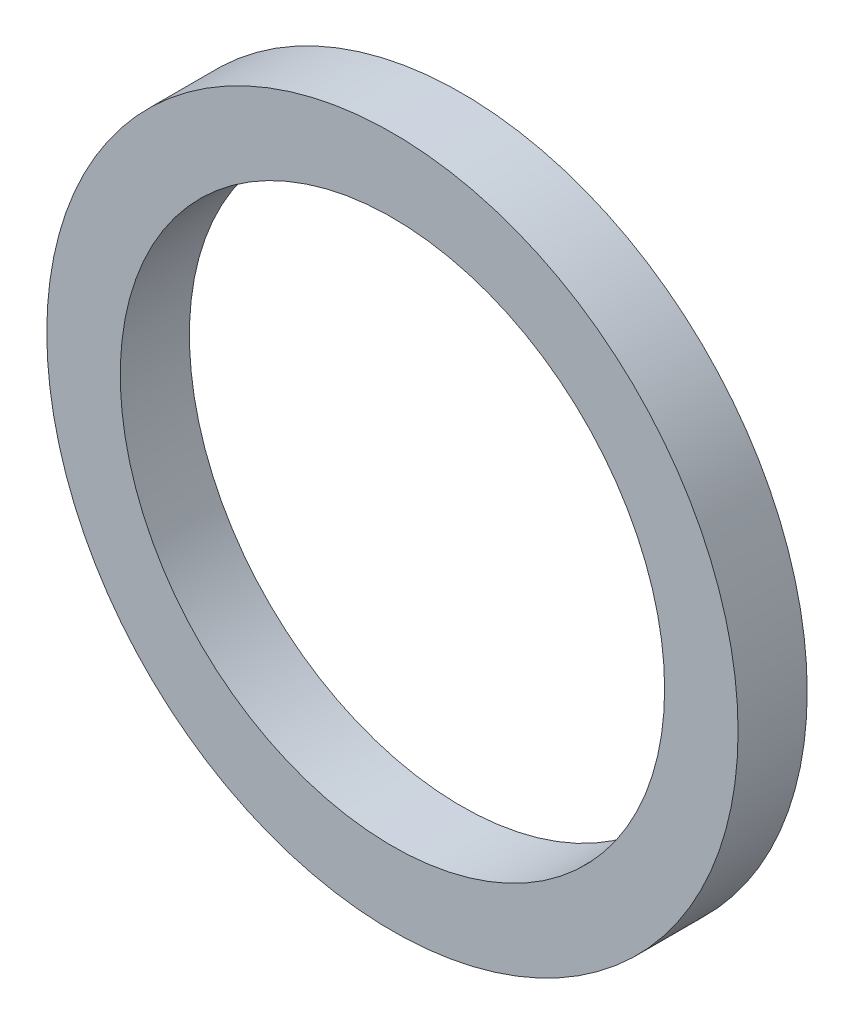
ISO-10303-21;
HEADER;
FILE_DESCRIPTION(('STEP AP214'),'2;1');
FILE_NAME('part.step','',(''),(''),'','','');
FILE_SCHEMA(('AUTOMOTIVE_DESIGN { 1 0 10303 214 1 1 1 1 }'));
ENDSEC;
DATA;
#1=APPLICATION_CONTEXT('core data for automotive mechanical design processes');
#2=APPLICATION_PROTOCOL_DEFINITION('international standard','automotive_design',2000,#1);
#3=PRODUCT_CONTEXT('',#1,'mechanical');
#4=PRODUCT('Part','Part','',(#3));
#5=PRODUCT_RELATED_PRODUCT_CATEGORY('part','',(#4));
#6=PRODUCT_DEFINITION_FORMATION('','',#4);
#7=PRODUCT_DEFINITION_CONTEXT('part definition',#1,'design');
#8=PRODUCT_DEFINITION('design','',#6,#7);
#9=PRODUCT_DEFINITION_SHAPE('','',#8);
#10=(LENGTH_UNIT() NAMED_UNIT(*) SI_UNIT(.MILLI.,.METRE.));
#11=(NAMED_UNIT(*) PLANE_ANGLE_UNIT() SI_UNIT($,.RADIAN.));
#12=(NAMED_UNIT(*) SI_UNIT($,.STERADIAN.) SOLID_ANGLE_UNIT());
#13=UNCERTAINTY_MEASURE_WITH_UNIT(LENGTH_MEASURE(1.E-05),#10,'distance_accuracy_value','');
#14=(GEOMETRIC_REPRESENTATION_CONTEXT(3) GLOBAL_UNCERTAINTY_ASSIGNED_CONTEXT((#13)) GLOBAL_UNIT_ASSIGNED_CONTEXT((#10,
#11,#12)) REPRESENTATION_CONTEXT('',''));
#15=CARTESIAN_POINT('',(0.,0.,0.));
#16=DIRECTION('',(0.,0.,1.));
#17=DIRECTION('',(1.,0.,0.));
#18=AXIS2_PLACEMENT_3D('',#15,#16,#17);
#19=CARTESIAN_POINT('',(0.,0.,0.));
#20=DIRECTION('',(0.,0.,1.));
#21=DIRECTION('',(1.,0.,0.));
#22=AXIS2_PLACEMENT_3D('',#19,#20,#21);
#23=CYLINDRICAL_SURFACE('',#22,15.75);
#24=CARTESIAN_POINT('',(0.,0.,0.));
#25=DIRECTION('',(0.,0.,1.));
#26=DIRECTION('',(1.,0.,0.));
#27=AXIS2_PLACEMENT_3D('',#24,#25,#26);
#28=CIRCLE('',#27,15.75);
#29=CARTESIAN_POINT('',(15.75,0.,0.));
#30=VERTEX_POINT('',#29);
#31=EDGE_CURVE('E25',#30,#30,#28,.T.);
#32=ORIENTED_EDGE('',*,*,#31,.F.);
#33=EDGE_LOOP('',(#32));
#34=FACE_BOUND('',#33,.T.);
#35=CARTESIAN_POINT('',(0.,0.,4.));
#36=DIRECTION('',(0.,0.,-1.));
#37=DIRECTION('',(1.,0.,0.));
#38=AXIS2_PLACEMENT_3D('',#35,#36,#37);
#39=CIRCLE('',#38,15.75);
#40=CARTESIAN_POINT('',(15.75,0.,4.));
#41=VERTEX_POINT('',#40);
#42=EDGE_CURVE('E50',#41,#41,#39,.T.);
#43=ORIENTED_EDGE('',*,*,#42,.F.);
#44=EDGE_LOOP('',(#43));
#45=FACE_BOUND('',#44,.T.);
#46=ADVANCED_FACE('F17',(#34,#45),#23,.F.);
#47=CARTESIAN_POINT('',(0.,0.,0.));
#48=DIRECTION('',(0.,0.,1.));
#49=DIRECTION('',(1.,0.,0.));
#50=AXIS2_PLACEMENT_3D('',#47,#48,#49);
#51=CYLINDRICAL_SURFACE('',#50,20.);
#52=CARTESIAN_POINT('',(0.,0.,0.));
#53=DIRECTION('',(0.,0.,1.));
#54=DIRECTION('',(1.,0.,0.));
#55=AXIS2_PLACEMENT_3D('',#52,#53,#54);
#56=CIRCLE('',#55,20.);
#57=CARTESIAN_POINT('',(20.,0.,0.));
#58=VERTEX_POINT('',#57);
#59=EDGE_CURVE('E11',#58,#58,#56,.T.);
#60=ORIENTED_EDGE('',*,*,#59,.T.);
#61=EDGE_LOOP('',(#60));
#62=FACE_BOUND('',#61,.T.);
#63=CARTESIAN_POINT('',(0.,0.,4.));
#64=DIRECTION('',(0.,0.,-1.));
#65=DIRECTION('',(1.,0.,0.));
#66=AXIS2_PLACEMENT_3D('',#63,#64,#65);
#67=CIRCLE('',#66,20.);
#68=CARTESIAN_POINT('',(20.,0.,4.));
#69=VERTEX_POINT('',#68);
#70=EDGE_CURVE('E54',#69,#69,#67,.T.);
#71=ORIENTED_EDGE('',*,*,#70,.T.);
#72=EDGE_LOOP('',(#71));
#73=FACE_BOUND('',#72,.T.);
#74=ADVANCED_FACE('F79',(#62,#73),#51,.T.);
#75=CARTESIAN_POINT('',(0.,0.,0.));
#76=DIRECTION('',(0.,0.,-1.));
#77=DIRECTION('',(0.,-1.,0.));
#78=AXIS2_PLACEMENT_3D('',#75,#76,#77);
#79=PLANE('',#78);
#80=ORIENTED_EDGE('',*,*,#59,.F.);
#81=EDGE_LOOP('',(#80));
#82=FACE_BOUND('',#81,.T.);
#83=ORIENTED_EDGE('',*,*,#31,.T.);
#84=EDGE_LOOP('',(#83));
#85=FACE_BOUND('',#84,.T.);
#86=ADVANCED_FACE('F70',(#82,#85),#79,.T.);
#87=CARTESIAN_POINT('',(0.,0.,4.));
#88=DIRECTION('',(0.,0.,1.));
#89=DIRECTION('',(1.,0.,0.));
#90=AXIS2_PLACEMENT_3D('',#87,#88,#89);
#91=PLANE('',#90);
#92=ORIENTED_EDGE('',*,*,#70,.F.);
#93=EDGE_LOOP('',(#92));
#94=FACE_BOUND('',#93,.T.);
#95=ORIENTED_EDGE('',*,*,#42,.T.);
#96=EDGE_LOOP('',(#95));
#97=FACE_BOUND('',#96,.T.);
#98=ADVANCED_FACE('F51',(#94,#97),#91,.T.);
#99=CLOSED_SHELL('',(#46,#74,#86,#98));
#100=MANIFOLD_SOLID_BREP('B1',#99);
#101=ADVANCED_BREP_SHAPE_REPRESENTATION('',(#18,#100),#14);
#102=SHAPE_DEFINITION_REPRESENTATION(#9,#101);
ENDSEC;
END-ISO-10303-21;
